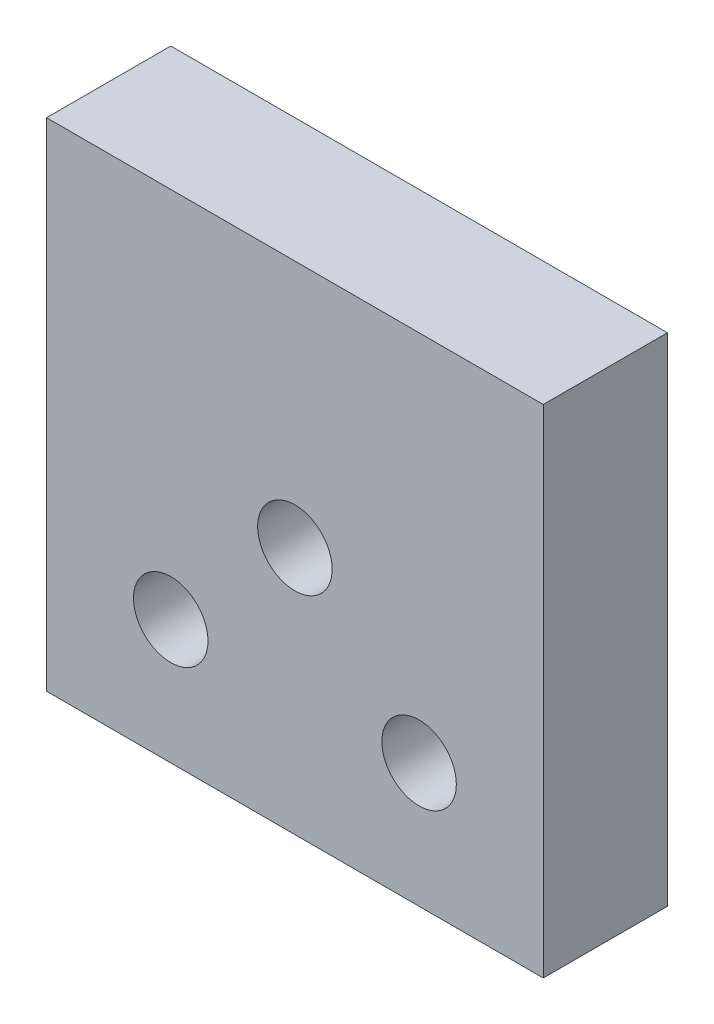
ISO-10303-21;
HEADER;
FILE_DESCRIPTION(('STEP AP214'),'2;1');
FILE_NAME('part.step','',(''),(''),'','','');
FILE_SCHEMA(('AUTOMOTIVE_DESIGN { 1 0 10303 214 1 1 1 1 }'));
ENDSEC;
DATA;
#1=APPLICATION_CONTEXT('core data for automotive mechanical design processes');
#2=APPLICATION_PROTOCOL_DEFINITION('international standard','automotive_design',2000,#1);
#3=PRODUCT_CONTEXT('',#1,'mechanical');
#4=PRODUCT('Part','Part','',(#3));
#5=PRODUCT_RELATED_PRODUCT_CATEGORY('part','',(#4));
#6=PRODUCT_DEFINITION_FORMATION('','',#4);
#7=PRODUCT_DEFINITION_CONTEXT('part definition',#1,'design');
#8=PRODUCT_DEFINITION('design','',#6,#7);
#9=PRODUCT_DEFINITION_SHAPE('','',#8);
#10=(LENGTH_UNIT() NAMED_UNIT(*) SI_UNIT(.MILLI.,.METRE.));
#11=(NAMED_UNIT(*) PLANE_ANGLE_UNIT() SI_UNIT($,.RADIAN.));
#12=(NAMED_UNIT(*) SI_UNIT($,.STERADIAN.) SOLID_ANGLE_UNIT());
#13=UNCERTAINTY_MEASURE_WITH_UNIT(LENGTH_MEASURE(1.E-05),#10,'distance_accuracy_value','');
#14=(GEOMETRIC_REPRESENTATION_CONTEXT(3) GLOBAL_UNCERTAINTY_ASSIGNED_CONTEXT((#13)) GLOBAL_UNIT_ASSIGNED_CONTEXT((#10,
#11,#12)) REPRESENTATION_CONTEXT('',''));
#15=CARTESIAN_POINT('',(0.,0.,0.));
#16=DIRECTION('',(0.,0.,1.));
#17=DIRECTION('',(1.,0.,0.));
#18=AXIS2_PLACEMENT_3D('',#15,#16,#17);
#19=CARTESIAN_POINT('',(0.,0.,5.));
#20=DIRECTION('',(0.,0.,1.));
#21=DIRECTION('',(1.,0.,0.));
#22=AXIS2_PLACEMENT_3D('',#19,#20,#21);
#23=PLANE('',#22);
#24=CARTESIAN_POINT('',(5.,-5.,5.));
#25=DIRECTION('',(0.,0.,1.));
#26=DIRECTION('',(1.,0.,0.));
#27=AXIS2_PLACEMENT_3D('',#24,#25,#26);
#28=CIRCLE('',#27,1.5);
#29=CARTESIAN_POINT('',(6.5,-5.,5.));
#30=VERTEX_POINT('',#29);
#31=EDGE_CURVE('E123',#30,#30,#28,.T.);
#32=ORIENTED_EDGE('',*,*,#31,.F.);
#33=EDGE_LOOP('',(#32));
#34=FACE_BOUND('',#33,.T.);
#35=CARTESIAN_POINT('',(-5.,-5.,5.));
#36=DIRECTION('',(0.,0.,1.));
#37=DIRECTION('',(1.,0.,0.));
#38=AXIS2_PLACEMENT_3D('',#35,#36,#37);
#39=CIRCLE('',#38,1.5);
#40=CARTESIAN_POINT('',(-3.5,-5.,5.));
#41=VERTEX_POINT('',#40);
#42=EDGE_CURVE('E113',#41,#41,#39,.T.);
#43=ORIENTED_EDGE('',*,*,#42,.F.);
#44=EDGE_LOOP('',(#43));
#45=FACE_BOUND('',#44,.T.);
#46=DIRECTION('',(0.,-1.,0.));
#47=VECTOR('',#46,1.);
#48=CARTESIAN_POINT('',(-10.,-10.,5.));
#49=LINE('',#48,#47);
#50=CARTESIAN_POINT('',(-10.,10.,5.));
#51=VERTEX_POINT('',#50);
#52=CARTESIAN_POINT('',(-10.,-10.,5.));
#53=VERTEX_POINT('',#52);
#54=EDGE_CURVE('E89',#51,#53,#49,.T.);
#55=ORIENTED_EDGE('',*,*,#54,.T.);
#56=DIRECTION('',(1.,0.,0.));
#57=VECTOR('',#56,1.);
#58=CARTESIAN_POINT('',(10.,-10.,5.));
#59=LINE('',#58,#57);
#60=CARTESIAN_POINT('',(10.,-10.,5.));
#61=VERTEX_POINT('',#60);
#62=EDGE_CURVE('E84',#53,#61,#59,.T.);
#63=ORIENTED_EDGE('',*,*,#62,.T.);
#64=DIRECTION('',(0.,1.,0.));
#65=VECTOR('',#64,1.);
#66=CARTESIAN_POINT('',(10.,-10.,5.));
#67=LINE('',#66,#65);
#68=CARTESIAN_POINT('',(10.,10.,5.));
#69=VERTEX_POINT('',#68);
#70=EDGE_CURVE('E87',#61,#69,#67,.T.);
#71=ORIENTED_EDGE('',*,*,#70,.T.);
#72=DIRECTION('',(-1.,0.,0.));
#73=VECTOR('',#72,1.);
#74=CARTESIAN_POINT('',(10.,10.,5.));
#75=LINE('',#74,#73);
#76=EDGE_CURVE('E54',#69,#51,#75,.T.);
#77=ORIENTED_EDGE('',*,*,#76,.T.);
#78=EDGE_LOOP('',(#55,#63,#71,#77));
#79=FACE_BOUND('',#78,.T.);
#80=CARTESIAN_POINT('',(0.,0.,5.));
#81=DIRECTION('',(0.,0.,1.));
#82=DIRECTION('',(1.,0.,0.));
#83=AXIS2_PLACEMENT_3D('',#80,#81,#82);
#84=CIRCLE('',#83,1.5);
#85=CARTESIAN_POINT('',(1.5,0.,5.));
#86=VERTEX_POINT('',#85);
#87=EDGE_CURVE('E105',#86,#86,#84,.T.);
#88=ORIENTED_EDGE('',*,*,#87,.F.);
#89=EDGE_LOOP('',(#88));
#90=FACE_BOUND('',#89,.T.);
#91=ADVANCED_FACE('F35',(#34,#45,#79,#90),#23,.T.);
#92=CARTESIAN_POINT('',(0.,0.,0.));
#93=DIRECTION('',(0.,0.,1.));
#94=DIRECTION('',(1.,0.,0.));
#95=AXIS2_PLACEMENT_3D('',#92,#93,#94);
#96=PLANE('',#95);
#97=CARTESIAN_POINT('',(5.,-5.,0.));
#98=DIRECTION('',(0.,0.,1.));
#99=DIRECTION('',(1.,0.,0.));
#100=AXIS2_PLACEMENT_3D('',#97,#98,#99);
#101=CIRCLE('',#100,1.5);
#102=CARTESIAN_POINT('',(6.5,-5.,0.));
#103=VERTEX_POINT('',#102);
#104=EDGE_CURVE('E39',#103,#103,#101,.T.);
#105=ORIENTED_EDGE('',*,*,#104,.T.);
#106=EDGE_LOOP('',(#105));
#107=FACE_BOUND('',#106,.T.);
#108=CARTESIAN_POINT('',(-5.,-5.,0.));
#109=DIRECTION('',(0.,0.,1.));
#110=DIRECTION('',(1.,0.,0.));
#111=AXIS2_PLACEMENT_3D('',#108,#109,#110);
#112=CIRCLE('',#111,1.5);
#113=CARTESIAN_POINT('',(-3.5,-5.,0.));
#114=VERTEX_POINT('',#113);
#115=EDGE_CURVE('E110',#114,#114,#112,.T.);
#116=ORIENTED_EDGE('',*,*,#115,.T.);
#117=EDGE_LOOP('',(#116));
#118=FACE_BOUND('',#117,.T.);
#119=DIRECTION('',(0.,-1.,0.));
#120=VECTOR('',#119,1.);
#121=CARTESIAN_POINT('',(-10.,-10.,0.));
#122=LINE('',#121,#120);
#123=CARTESIAN_POINT('',(-10.,10.,0.));
#124=VERTEX_POINT('',#123);
#125=CARTESIAN_POINT('',(-10.,-10.,0.));
#126=VERTEX_POINT('',#125);
#127=EDGE_CURVE('E102',#124,#126,#122,.T.);
#128=ORIENTED_EDGE('',*,*,#127,.F.);
#129=DIRECTION('',(-1.,0.,0.));
#130=VECTOR('',#129,1.);
#131=CARTESIAN_POINT('',(10.,10.,0.));
#132=LINE('',#131,#130);
#133=CARTESIAN_POINT('',(10.,10.,0.));
#134=VERTEX_POINT('',#133);
#135=EDGE_CURVE('E77',#134,#124,#132,.T.);
#136=ORIENTED_EDGE('',*,*,#135,.F.);
#137=DIRECTION('',(0.,1.,0.));
#138=VECTOR('',#137,1.);
#139=CARTESIAN_POINT('',(10.,-10.,0.));
#140=LINE('',#139,#138);
#141=CARTESIAN_POINT('',(10.,-10.,0.));
#142=VERTEX_POINT('',#141);
#143=EDGE_CURVE('E71',#142,#134,#140,.T.);
#144=ORIENTED_EDGE('',*,*,#143,.F.);
#145=DIRECTION('',(1.,0.,0.));
#146=VECTOR('',#145,1.);
#147=CARTESIAN_POINT('',(10.,-10.,0.));
#148=LINE('',#147,#146);
#149=EDGE_CURVE('E93',#126,#142,#148,.T.);
#150=ORIENTED_EDGE('',*,*,#149,.F.);
#151=EDGE_LOOP('',(#128,#136,#144,#150));
#152=FACE_BOUND('',#151,.T.);
#153=CARTESIAN_POINT('',(0.,0.,0.));
#154=DIRECTION('',(0.,0.,1.));
#155=DIRECTION('',(1.,0.,0.));
#156=AXIS2_PLACEMENT_3D('',#153,#154,#155);
#157=CIRCLE('',#156,1.5);
#158=CARTESIAN_POINT('',(1.5,0.,0.));
#159=VERTEX_POINT('',#158);
#160=EDGE_CURVE('E112',#159,#159,#157,.T.);
#161=ORIENTED_EDGE('',*,*,#160,.T.);
#162=EDGE_LOOP('',(#161));
#163=FACE_BOUND('',#162,.T.);
#164=ADVANCED_FACE('F132',(#107,#118,#152,#163),#96,.F.);
#165=CARTESIAN_POINT('',(-10.,-10.,5.));
#166=DIRECTION('',(1.,0.,0.));
#167=DIRECTION('',(0.,0.,-1.));
#168=AXIS2_PLACEMENT_3D('',#165,#166,#167);
#169=PLANE('',#168);
#170=ORIENTED_EDGE('',*,*,#127,.T.);
#171=DIRECTION('',(0.,0.,-1.));
#172=VECTOR('',#171,1.);
#173=CARTESIAN_POINT('',(-10.,-10.,5.));
#174=LINE('',#173,#172);
#175=EDGE_CURVE('E11',#53,#126,#174,.T.);
#176=ORIENTED_EDGE('',*,*,#175,.F.);
#177=ORIENTED_EDGE('',*,*,#54,.F.);
#178=DIRECTION('',(0.,0.,-1.));
#179=VECTOR('',#178,1.);
#180=CARTESIAN_POINT('',(-10.,10.,5.));
#181=LINE('',#180,#179);
#182=EDGE_CURVE('E98',#51,#124,#181,.T.);
#183=ORIENTED_EDGE('',*,*,#182,.T.);
#184=EDGE_LOOP('',(#170,#176,#177,#183));
#185=FACE_BOUND('',#184,.T.);
#186=ADVANCED_FACE('F37',(#185),#169,.F.);
#187=CARTESIAN_POINT('',(10.,-10.,5.));
#188=DIRECTION('',(0.,1.,0.));
#189=DIRECTION('',(-1.,0.,0.));
#190=AXIS2_PLACEMENT_3D('',#187,#188,#189);
#191=PLANE('',#190);
#192=ORIENTED_EDGE('',*,*,#149,.T.);
#193=DIRECTION('',(0.,0.,-1.));
#194=VECTOR('',#193,1.);
#195=CARTESIAN_POINT('',(10.,-10.,5.));
#196=LINE('',#195,#194);
#197=EDGE_CURVE('E45',#61,#142,#196,.T.);
#198=ORIENTED_EDGE('',*,*,#197,.F.);
#199=ORIENTED_EDGE('',*,*,#62,.F.);
#200=ORIENTED_EDGE('',*,*,#175,.T.);
#201=EDGE_LOOP('',(#192,#198,#199,#200));
#202=FACE_BOUND('',#201,.T.);
#203=ADVANCED_FACE('F92',(#202),#191,.F.);
#204=CARTESIAN_POINT('',(10.,-10.,5.));
#205=DIRECTION('',(-1.,0.,0.));
#206=DIRECTION('',(0.,0.,1.));
#207=AXIS2_PLACEMENT_3D('',#204,#205,#206);
#208=PLANE('',#207);
#209=ORIENTED_EDGE('',*,*,#143,.T.);
#210=DIRECTION('',(0.,0.,-1.));
#211=VECTOR('',#210,1.);
#212=CARTESIAN_POINT('',(10.,10.,5.));
#213=LINE('',#212,#211);
#214=EDGE_CURVE('E94',#69,#134,#213,.T.);
#215=ORIENTED_EDGE('',*,*,#214,.F.);
#216=ORIENTED_EDGE('',*,*,#70,.F.);
#217=ORIENTED_EDGE('',*,*,#197,.T.);
#218=EDGE_LOOP('',(#209,#215,#216,#217));
#219=FACE_BOUND('',#218,.T.);
#220=ADVANCED_FACE('F96',(#219),#208,.F.);
#221=CARTESIAN_POINT('',(10.,10.,5.));
#222=DIRECTION('',(0.,-1.,0.));
#223=DIRECTION('',(1.,0.,0.));
#224=AXIS2_PLACEMENT_3D('',#221,#222,#223);
#225=PLANE('',#224);
#226=ORIENTED_EDGE('',*,*,#135,.T.);
#227=ORIENTED_EDGE('',*,*,#182,.F.);
#228=ORIENTED_EDGE('',*,*,#76,.F.);
#229=ORIENTED_EDGE('',*,*,#214,.T.);
#230=EDGE_LOOP('',(#226,#227,#228,#229));
#231=FACE_BOUND('',#230,.T.);
#232=ADVANCED_FACE('F145',(#231),#225,.F.);
#233=CARTESIAN_POINT('',(0.,0.,5.));
#234=DIRECTION('',(0.,0.,-1.));
#235=DIRECTION('',(-1.,0.,0.));
#236=AXIS2_PLACEMENT_3D('',#233,#234,#235);
#237=CYLINDRICAL_SURFACE('',#236,1.5);
#238=ORIENTED_EDGE('',*,*,#87,.T.);
#239=EDGE_LOOP('',(#238));
#240=FACE_BOUND('',#239,.T.);
#241=ORIENTED_EDGE('',*,*,#160,.F.);
#242=EDGE_LOOP('',(#241));
#243=FACE_BOUND('',#242,.T.);
#244=ADVANCED_FACE('F129',(#240,#243),#237,.F.);
#245=CARTESIAN_POINT('',(-5.,-5.,-5.));
#246=DIRECTION('',(0.,0.,1.));
#247=DIRECTION('',(1.,0.,0.));
#248=AXIS2_PLACEMENT_3D('',#245,#246,#247);
#249=CYLINDRICAL_SURFACE('',#248,1.5);
#250=ORIENTED_EDGE('',*,*,#42,.T.);
#251=EDGE_LOOP('',(#250));
#252=FACE_BOUND('',#251,.T.);
#253=ORIENTED_EDGE('',*,*,#115,.F.);
#254=EDGE_LOOP('',(#253));
#255=FACE_BOUND('',#254,.T.);
#256=ADVANCED_FACE('F161',(#252,#255),#249,.F.);
#257=CARTESIAN_POINT('',(5.,-5.,-5.));
#258=DIRECTION('',(0.,0.,1.));
#259=DIRECTION('',(1.,0.,0.));
#260=AXIS2_PLACEMENT_3D('',#257,#258,#259);
#261=CYLINDRICAL_SURFACE('',#260,1.5);
#262=ORIENTED_EDGE('',*,*,#31,.T.);
#263=EDGE_LOOP('',(#262));
#264=FACE_BOUND('',#263,.T.);
#265=ORIENTED_EDGE('',*,*,#104,.F.);
#266=EDGE_LOOP('',(#265));
#267=FACE_BOUND('',#266,.T.);
#268=ADVANCED_FACE('F165',(#264,#267),#261,.F.);
#269=CLOSED_SHELL('',(#91,#164,#186,#203,#220,#232,#244,#256,#268));
#270=MANIFOLD_SOLID_BREP('B2',#269);
#271=ADVANCED_BREP_SHAPE_REPRESENTATION('',(#18,#270),#14);
#272=SHAPE_DEFINITION_REPRESENTATION(#9,#271);
ENDSEC;
END-ISO-10303-21;
